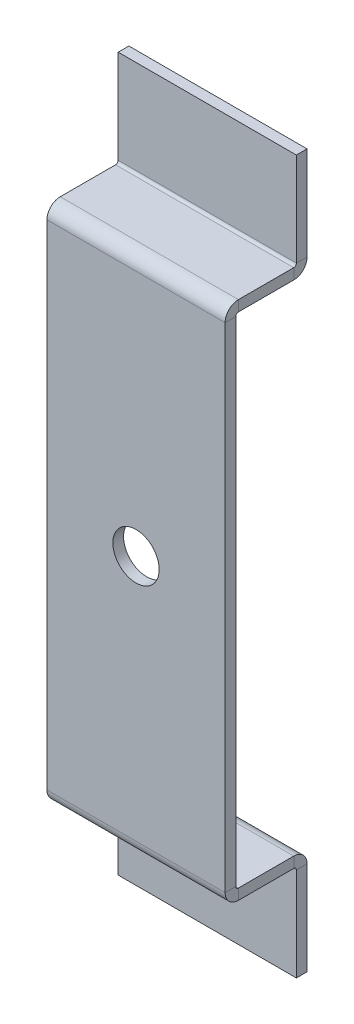
ISO-10303-21;
HEADER;
FILE_DESCRIPTION(('STEP AP214'),'2;1');
FILE_NAME('part.step','',(''),(''),'','','');
FILE_SCHEMA(('AUTOMOTIVE_DESIGN { 1 0 10303 214 1 1 1 1 }'));
ENDSEC;
DATA;
#1=APPLICATION_CONTEXT('core data for automotive mechanical design processes');
#2=APPLICATION_PROTOCOL_DEFINITION('international standard','automotive_design',2000,#1);
#3=PRODUCT_CONTEXT('',#1,'mechanical');
#4=PRODUCT('Part','Part','',(#3));
#5=PRODUCT_RELATED_PRODUCT_CATEGORY('part','',(#4));
#6=PRODUCT_DEFINITION_FORMATION('','',#4);
#7=PRODUCT_DEFINITION_CONTEXT('part definition',#1,'design');
#8=PRODUCT_DEFINITION('design','',#6,#7);
#9=PRODUCT_DEFINITION_SHAPE('','',#8);
#10=(LENGTH_UNIT() NAMED_UNIT(*) SI_UNIT(.MILLI.,.METRE.));
#11=(NAMED_UNIT(*) PLANE_ANGLE_UNIT() SI_UNIT($,.RADIAN.));
#12=(NAMED_UNIT(*) SI_UNIT($,.STERADIAN.) SOLID_ANGLE_UNIT());
#13=UNCERTAINTY_MEASURE_WITH_UNIT(LENGTH_MEASURE(1.E-05),#10,'distance_accuracy_value','');
#14=(GEOMETRIC_REPRESENTATION_CONTEXT(3) GLOBAL_UNCERTAINTY_ASSIGNED_CONTEXT((#13)) GLOBAL_UNIT_ASSIGNED_CONTEXT((#10,
#11,#12)) REPRESENTATION_CONTEXT('',''));
#15=CARTESIAN_POINT('',(0.,0.,0.));
#16=DIRECTION('',(0.,0.,1.));
#17=DIRECTION('',(1.,0.,0.));
#18=AXIS2_PLACEMENT_3D('',#15,#16,#17);
#19=CARTESIAN_POINT('',(0.,143.,-20.));
#20=DIRECTION('',(-1.,0.,0.));
#21=DIRECTION('',(0.,0.,1.));
#22=AXIS2_PLACEMENT_3D('',#19,#20,#21);
#23=PLANE('',#22);
#24=DIRECTION('',(0.,0.,-1.));
#25=VECTOR('',#24,1.);
#26=CARTESIAN_POINT('',(0.,143.,-20.));
#27=LINE('',#26,#25);
#28=CARTESIAN_POINT('',(0.,143.,-3.7366));
#29=VERTEX_POINT('',#28);
#30=CARTESIAN_POINT('',(0.,143.,-19.2634));
#31=VERTEX_POINT('',#30);
#32=EDGE_CURVE('E351',#29,#31,#27,.T.);
#33=ORIENTED_EDGE('',*,*,#32,.T.);
#34=DIRECTION('',(0.,-1.,0.));
#35=VECTOR('',#34,1.);
#36=CARTESIAN_POINT('',(0.,143.,-19.2634));
#37=LINE('',#36,#35);
#38=CARTESIAN_POINT('',(0.,140.,-19.2634));
#39=VERTEX_POINT('',#38);
#40=EDGE_CURVE('E233',#31,#39,#37,.T.);
#41=ORIENTED_EDGE('',*,*,#40,.T.);
#42=DIRECTION('',(0.,0.,-1.));
#43=VECTOR('',#42,1.);
#44=CARTESIAN_POINT('',(0.,140.,-20.));
#45=LINE('',#44,#43);
#46=CARTESIAN_POINT('',(0.,140.,-3.73660000000001));
#47=VERTEX_POINT('',#46);
#48=EDGE_CURVE('E350',#47,#39,#45,.T.);
#49=ORIENTED_EDGE('',*,*,#48,.F.);
#50=DIRECTION('',(0.,1.,0.));
#51=VECTOR('',#50,1.);
#52=CARTESIAN_POINT('',(0.,140.,-3.73660000000001));
#53=LINE('',#52,#51);
#54=EDGE_CURVE('E336',#47,#29,#53,.T.);
#55=ORIENTED_EDGE('',*,*,#54,.T.);
#56=EDGE_LOOP('',(#33,#41,#49,#55));
#57=FACE_BOUND('',#56,.T.);
#58=ADVANCED_FACE('F39',(#57),#23,.T.);
#59=CARTESIAN_POINT('',(0.,143.,4.67625101215123E-13));
#60=DIRECTION('',(0.,1.,0.));
#61=DIRECTION('',(0.,0.,1.));
#62=AXIS2_PLACEMENT_3D('',#59,#60,#61);
#63=PLANE('',#62);
#64=DIRECTION('',(0.,0.,1.));
#65=VECTOR('',#64,1.);
#66=CARTESIAN_POINT('',(50.,143.,-2.99999999999999));
#67=LINE('',#66,#65);
#68=CARTESIAN_POINT('',(50.,143.,-19.2634));
#69=VERTEX_POINT('',#68);
#70=CARTESIAN_POINT('',(50.,143.,-3.7366));
#71=VERTEX_POINT('',#70);
#72=EDGE_CURVE('E353',#69,#71,#67,.T.);
#73=ORIENTED_EDGE('',*,*,#72,.F.);
#74=DIRECTION('',(-1.,0.,0.));
#75=VECTOR('',#74,1.);
#76=CARTESIAN_POINT('',(0.,143.,-19.2634));
#77=LINE('',#76,#75);
#78=EDGE_CURVE('E63',#31,#69,#77,.F.);
#79=ORIENTED_EDGE('',*,*,#78,.F.);
#80=ORIENTED_EDGE('',*,*,#32,.F.);
#81=DIRECTION('',(1.,0.,0.));
#82=VECTOR('',#81,1.);
#83=CARTESIAN_POINT('',(0.,143.,-3.7366));
#84=LINE('',#83,#82);
#85=EDGE_CURVE('E345',#29,#71,#84,.T.);
#86=ORIENTED_EDGE('',*,*,#85,.T.);
#87=EDGE_LOOP('',(#73,#79,#80,#86));
#88=FACE_BOUND('',#87,.T.);
#89=ADVANCED_FACE('F400',(#88),#63,.T.);
#90=CARTESIAN_POINT('',(0.,140.,4.57150657198594E-13));
#91=DIRECTION('',(0.,1.,0.));
#92=DIRECTION('',(0.,0.,1.));
#93=AXIS2_PLACEMENT_3D('',#90,#91,#92);
#94=PLANE('',#93);
#95=DIRECTION('',(-1.,0.,0.));
#96=VECTOR('',#95,1.);
#97=CARTESIAN_POINT('',(0.,140.,-19.2634));
#98=LINE('',#97,#96);
#99=CARTESIAN_POINT('',(50.,140.,-19.2634));
#100=VERTEX_POINT('',#99);
#101=EDGE_CURVE('E186',#39,#100,#98,.F.);
#102=ORIENTED_EDGE('',*,*,#101,.T.);
#103=DIRECTION('',(0.,0.,1.));
#104=VECTOR('',#103,1.);
#105=CARTESIAN_POINT('',(50.,140.,-3.));
#106=LINE('',#105,#104);
#107=CARTESIAN_POINT('',(50.,140.,-3.73660000000001));
#108=VERTEX_POINT('',#107);
#109=EDGE_CURVE('E354',#100,#108,#106,.T.);
#110=ORIENTED_EDGE('',*,*,#109,.T.);
#111=DIRECTION('',(1.,0.,0.));
#112=VECTOR('',#111,1.);
#113=CARTESIAN_POINT('',(0.,140.,-3.73660000000001));
#114=LINE('',#113,#112);
#115=EDGE_CURVE('E339',#47,#108,#114,.T.);
#116=ORIENTED_EDGE('',*,*,#115,.F.);
#117=ORIENTED_EDGE('',*,*,#48,.T.);
#118=EDGE_LOOP('',(#102,#110,#116,#117));
#119=FACE_BOUND('',#118,.T.);
#120=ADVANCED_FACE('F408',(#119),#94,.F.);
#121=CARTESIAN_POINT('',(50.,-3.,-2.99999999999999));
#122=DIRECTION('',(1.,0.,0.));
#123=DIRECTION('',(0.,0.,-1.));
#124=AXIS2_PLACEMENT_3D('',#121,#122,#123);
#125=PLANE('',#124);
#126=DIRECTION('',(0.,0.,-1.));
#127=VECTOR('',#126,1.);
#128=CARTESIAN_POINT('',(50.,-3.,-2.99999999999999));
#129=LINE('',#128,#127);
#130=CARTESIAN_POINT('',(50.,-3.,-3.73659999999999));
#131=VERTEX_POINT('',#130);
#132=CARTESIAN_POINT('',(50.,-3.00000000000006,-19.2634));
#133=VERTEX_POINT('',#132);
#134=EDGE_CURVE('E306',#131,#133,#129,.T.);
#135=ORIENTED_EDGE('',*,*,#134,.T.);
#136=DIRECTION('',(0.,1.,0.));
#137=VECTOR('',#136,1.);
#138=CARTESIAN_POINT('',(50.,-3.00000000000006,-19.2634));
#139=LINE('',#138,#137);
#140=CARTESIAN_POINT('',(50.,0.,-19.2634));
#141=VERTEX_POINT('',#140);
#142=EDGE_CURVE('E279',#133,#141,#139,.T.);
#143=ORIENTED_EDGE('',*,*,#142,.T.);
#144=DIRECTION('',(0.,0.,-1.));
#145=VECTOR('',#144,1.);
#146=CARTESIAN_POINT('',(50.,0.,-3.));
#147=LINE('',#146,#145);
#148=CARTESIAN_POINT('',(50.,0.,-3.7366));
#149=VERTEX_POINT('',#148);
#150=EDGE_CURVE('E305',#149,#141,#147,.T.);
#151=ORIENTED_EDGE('',*,*,#150,.F.);
#152=DIRECTION('',(0.,-1.,0.));
#153=VECTOR('',#152,1.);
#154=CARTESIAN_POINT('',(50.,0.,-3.7366));
#155=LINE('',#154,#153);
#156=EDGE_CURVE('E292',#149,#131,#155,.T.);
#157=ORIENTED_EDGE('',*,*,#156,.T.);
#158=EDGE_LOOP('',(#135,#143,#151,#157));
#159=FACE_BOUND('',#158,.T.);
#160=ADVANCED_FACE('F432',(#159),#125,.T.);
#161=CARTESIAN_POINT('',(0.,-2.99999999999999,0.));
#162=DIRECTION('',(0.,1.,0.));
#163=DIRECTION('',(0.,0.,1.));
#164=AXIS2_PLACEMENT_3D('',#161,#162,#163);
#165=PLANE('',#164);
#166=DIRECTION('',(1.,0.,0.));
#167=VECTOR('',#166,1.);
#168=CARTESIAN_POINT('',(50.,-3.00000000000006,-19.2634));
#169=LINE('',#168,#167);
#170=CARTESIAN_POINT('',(0.,-3.00000000000006,-19.2634));
#171=VERTEX_POINT('',#170);
#172=EDGE_CURVE('E285',#133,#171,#169,.F.);
#173=ORIENTED_EDGE('',*,*,#172,.F.);
#174=ORIENTED_EDGE('',*,*,#134,.F.);
#175=DIRECTION('',(1.,0.,0.));
#176=VECTOR('',#175,1.);
#177=CARTESIAN_POINT('',(0.,-3.,-3.73659999999999));
#178=LINE('',#177,#176);
#179=CARTESIAN_POINT('',(0.,-3.,-3.73659999999999));
#180=VERTEX_POINT('',#179);
#181=EDGE_CURVE('E301',#180,#131,#178,.T.);
#182=ORIENTED_EDGE('',*,*,#181,.F.);
#183=DIRECTION('',(0.,0.,1.));
#184=VECTOR('',#183,1.);
#185=CARTESIAN_POINT('',(0.,-3.00000000000006,-20.));
#186=LINE('',#185,#184);
#187=EDGE_CURVE('E309',#171,#180,#186,.T.);
#188=ORIENTED_EDGE('',*,*,#187,.F.);
#189=EDGE_LOOP('',(#173,#174,#182,#188));
#190=FACE_BOUND('',#189,.T.);
#191=ADVANCED_FACE('F445',(#190),#165,.F.);
#192=CARTESIAN_POINT('',(0.,0.,0.));
#193=DIRECTION('',(0.,1.,0.));
#194=DIRECTION('',(0.,0.,1.));
#195=AXIS2_PLACEMENT_3D('',#192,#193,#194);
#196=PLANE('',#195);
#197=ORIENTED_EDGE('',*,*,#150,.T.);
#198=DIRECTION('',(1.,0.,0.));
#199=VECTOR('',#198,1.);
#200=CARTESIAN_POINT('',(50.,0.,-19.2634));
#201=LINE('',#200,#199);
#202=CARTESIAN_POINT('',(0.,0.,-19.2634));
#203=VERTEX_POINT('',#202);
#204=EDGE_CURVE('E272',#141,#203,#201,.F.);
#205=ORIENTED_EDGE('',*,*,#204,.T.);
#206=DIRECTION('',(0.,0.,1.));
#207=VECTOR('',#206,1.);
#208=CARTESIAN_POINT('',(0.,0.,-20.));
#209=LINE('',#208,#207);
#210=CARTESIAN_POINT('',(0.,0.,-3.7366));
#211=VERTEX_POINT('',#210);
#212=EDGE_CURVE('E310',#203,#211,#209,.T.);
#213=ORIENTED_EDGE('',*,*,#212,.T.);
#214=DIRECTION('',(-1.,0.,0.));
#215=VECTOR('',#214,1.);
#216=CARTESIAN_POINT('',(50.,0.,-3.7366));
#217=LINE('',#216,#215);
#218=EDGE_CURVE('E295',#149,#211,#217,.T.);
#219=ORIENTED_EDGE('',*,*,#218,.F.);
#220=EDGE_LOOP('',(#197,#205,#213,#219));
#221=FACE_BOUND('',#220,.T.);
#222=ADVANCED_FACE('F429',(#221),#196,.T.);
#223=CARTESIAN_POINT('',(0.,0.,-3.));
#224=DIRECTION('',(0.,0.,-1.));
#225=DIRECTION('',(-1.,0.,0.));
#226=AXIS2_PLACEMENT_3D('',#223,#224,#225);
#227=PLANE('',#226);
#228=CARTESIAN_POINT('',(25.,69.9999999999999,-3.));
#229=DIRECTION('',(0.,0.,-1.));
#230=DIRECTION('',(-1.,0.,0.));
#231=AXIS2_PLACEMENT_3D('',#228,#229,#230);
#232=CIRCLE('',#231,6.50000000000001);
#233=CARTESIAN_POINT('',(18.5,69.9999999999999,-3.));
#234=VERTEX_POINT('',#233);
#235=EDGE_CURVE('E489',#234,#234,#232,.T.);
#236=ORIENTED_EDGE('',*,*,#235,.F.);
#237=EDGE_LOOP('',(#236));
#238=FACE_BOUND('',#237,.T.);
#239=DIRECTION('',(0.,1.,0.));
#240=VECTOR('',#239,1.);
#241=CARTESIAN_POINT('',(50.,0.,-3.));
#242=LINE('',#241,#240);
#243=CARTESIAN_POINT('',(50.,0.736600000000001,-3.));
#244=VERTEX_POINT('',#243);
#245=CARTESIAN_POINT('',(50.,139.2634,-3.));
#246=VERTEX_POINT('',#245);
#247=EDGE_CURVE('E11',#244,#246,#242,.T.);
#248=ORIENTED_EDGE('',*,*,#247,.F.);
#249=DIRECTION('',(-1.,0.,0.));
#250=VECTOR('',#249,1.);
#251=CARTESIAN_POINT('',(0.,0.736599999999997,-3.));
#252=LINE('',#251,#250);
#253=CARTESIAN_POINT('',(0.,0.736599999999997,-3.));
#254=VERTEX_POINT('',#253);
#255=EDGE_CURVE('E328',#254,#244,#252,.F.);
#256=ORIENTED_EDGE('',*,*,#255,.F.);
#257=DIRECTION('',(0.,-1.,0.));
#258=VECTOR('',#257,1.);
#259=CARTESIAN_POINT('',(0.,0.,-3.));
#260=LINE('',#259,#258);
#261=CARTESIAN_POINT('',(0.,139.2634,-3.));
#262=VERTEX_POINT('',#261);
#263=EDGE_CURVE('E48',#262,#254,#260,.T.);
#264=ORIENTED_EDGE('',*,*,#263,.F.);
#265=DIRECTION('',(1.,0.,0.));
#266=VECTOR('',#265,1.);
#267=CARTESIAN_POINT('',(50.,139.2634,-3.));
#268=LINE('',#267,#266);
#269=EDGE_CURVE('E372',#246,#262,#268,.F.);
#270=ORIENTED_EDGE('',*,*,#269,.F.);
#271=EDGE_LOOP('',(#248,#256,#264,#270));
#272=FACE_BOUND('',#271,.T.);
#273=ADVANCED_FACE('F415',(#238,#272),#227,.T.);
#274=CARTESIAN_POINT('',(0.,0.,0.));
#275=DIRECTION('',(0.,0.,-1.));
#276=DIRECTION('',(-1.,0.,0.));
#277=AXIS2_PLACEMENT_3D('',#274,#275,#276);
#278=PLANE('',#277);
#279=CARTESIAN_POINT('',(25.,69.9999999999999,0.));
#280=DIRECTION('',(0.,0.,1.));
#281=DIRECTION('',(1.,0.,0.));
#282=AXIS2_PLACEMENT_3D('',#279,#280,#281);
#283=CIRCLE('',#282,6.50000000000001);
#284=CARTESIAN_POINT('',(31.5,69.9999999999999,0.));
#285=VERTEX_POINT('',#284);
#286=EDGE_CURVE('E487',#285,#285,#283,.T.);
#287=ORIENTED_EDGE('',*,*,#286,.F.);
#288=EDGE_LOOP('',(#287));
#289=FACE_BOUND('',#288,.T.);
#290=DIRECTION('',(-1.,0.,0.));
#291=VECTOR('',#290,1.);
#292=CARTESIAN_POINT('',(0.,0.736600000000005,0.));
#293=LINE('',#292,#291);
#294=CARTESIAN_POINT('',(0.,0.736600000000005,0.));
#295=VERTEX_POINT('',#294);
#296=CARTESIAN_POINT('',(50.,0.736600000000001,0.));
#297=VERTEX_POINT('',#296);
#298=EDGE_CURVE('E316',#295,#297,#293,.F.);
#299=ORIENTED_EDGE('',*,*,#298,.T.);
#300=DIRECTION('',(0.,1.,0.));
#301=VECTOR('',#300,1.);
#302=CARTESIAN_POINT('',(50.,0.,0.));
#303=LINE('',#302,#301);
#304=CARTESIAN_POINT('',(50.,139.2634,0.));
#305=VERTEX_POINT('',#304);
#306=EDGE_CURVE('E43',#297,#305,#303,.T.);
#307=ORIENTED_EDGE('',*,*,#306,.T.);
#308=DIRECTION('',(1.,0.,0.));
#309=VECTOR('',#308,1.);
#310=CARTESIAN_POINT('',(50.,139.2634,0.));
#311=LINE('',#310,#309);
#312=CARTESIAN_POINT('',(0.,139.2634,0.));
#313=VERTEX_POINT('',#312);
#314=EDGE_CURVE('E360',#305,#313,#311,.F.);
#315=ORIENTED_EDGE('',*,*,#314,.T.);
#316=DIRECTION('',(0.,-1.,0.));
#317=VECTOR('',#316,1.);
#318=CARTESIAN_POINT('',(0.,0.,0.));
#319=LINE('',#318,#317);
#320=EDGE_CURVE('E380',#313,#295,#319,.T.);
#321=ORIENTED_EDGE('',*,*,#320,.T.);
#322=EDGE_LOOP('',(#299,#307,#315,#321));
#323=FACE_BOUND('',#322,.T.);
#324=ADVANCED_FACE('F388',(#289,#323),#278,.F.);
#325=CARTESIAN_POINT('',(0.,0.,-3.));
#326=DIRECTION('',(-1.,0.,0.));
#327=DIRECTION('',(0.,-1.,0.));
#328=AXIS2_PLACEMENT_3D('',#325,#326,#327);
#329=PLANE('',#328);
#330=ORIENTED_EDGE('',*,*,#263,.T.);
#331=DIRECTION('',(0.,0.,1.));
#332=VECTOR('',#331,1.);
#333=CARTESIAN_POINT('',(0.,0.736599999999997,-3.));
#334=LINE('',#333,#332);
#335=EDGE_CURVE('E322',#254,#295,#334,.T.);
#336=ORIENTED_EDGE('',*,*,#335,.T.);
#337=ORIENTED_EDGE('',*,*,#320,.F.);
#338=DIRECTION('',(0.,0.,1.));
#339=VECTOR('',#338,1.);
#340=CARTESIAN_POINT('',(0.,139.2634,-3.));
#341=LINE('',#340,#339);
#342=EDGE_CURVE('E377',#262,#313,#341,.T.);
#343=ORIENTED_EDGE('',*,*,#342,.F.);
#344=EDGE_LOOP('',(#330,#336,#337,#343));
#345=FACE_BOUND('',#344,.T.);
#346=ADVANCED_FACE('F41',(#345),#329,.T.);
#347=CARTESIAN_POINT('',(50.,0.,-3.));
#348=DIRECTION('',(1.,0.,0.));
#349=DIRECTION('',(0.,1.,0.));
#350=AXIS2_PLACEMENT_3D('',#347,#348,#349);
#351=PLANE('',#350);
#352=DIRECTION('',(0.,0.,1.));
#353=VECTOR('',#352,1.);
#354=CARTESIAN_POINT('',(50.,0.736600000000001,-3.));
#355=LINE('',#354,#353);
#356=EDGE_CURVE('E333',#244,#297,#355,.T.);
#357=ORIENTED_EDGE('',*,*,#356,.F.);
#358=ORIENTED_EDGE('',*,*,#247,.T.);
#359=DIRECTION('',(0.,0.,1.));
#360=VECTOR('',#359,1.);
#361=CARTESIAN_POINT('',(50.,139.2634,-3.));
#362=LINE('',#361,#360);
#363=EDGE_CURVE('E366',#246,#305,#362,.T.);
#364=ORIENTED_EDGE('',*,*,#363,.T.);
#365=ORIENTED_EDGE('',*,*,#306,.F.);
#366=EDGE_LOOP('',(#357,#358,#364,#365));
#367=FACE_BOUND('',#366,.T.);
#368=ADVANCED_FACE('F455',(#367),#351,.T.);
#369=CARTESIAN_POINT('',(0.,139.2634,-3.73660000000001));
#370=DIRECTION('',(-1.,0.,0.));
#371=DIRECTION('',(0.,0.,1.));
#372=AXIS2_PLACEMENT_3D('',#369,#370,#371);
#373=PLANE('',#372);
#374=ORIENTED_EDGE('',*,*,#54,.F.);
#375=CARTESIAN_POINT('',(0.,139.2634,-3.73660000000001));
#376=DIRECTION('',(1.,0.,0.));
#377=DIRECTION('',(0.,0.,-1.));
#378=AXIS2_PLACEMENT_3D('',#375,#376,#377);
#379=CIRCLE('',#378,0.736600000000004);
#380=EDGE_CURVE('E369',#262,#47,#379,.F.);
#381=ORIENTED_EDGE('',*,*,#380,.F.);
#382=ORIENTED_EDGE('',*,*,#342,.T.);
#383=CARTESIAN_POINT('',(0.,139.2634,-3.73660000000001));
#384=DIRECTION('',(1.,0.,0.));
#385=DIRECTION('',(0.,0.,-1.));
#386=AXIS2_PLACEMENT_3D('',#383,#384,#385);
#387=CIRCLE('',#386,3.7366);
#388=EDGE_CURVE('E362',#313,#29,#387,.F.);
#389=ORIENTED_EDGE('',*,*,#388,.T.);
#390=EDGE_LOOP('',(#374,#381,#382,#389));
#391=FACE_BOUND('',#390,.T.);
#392=ADVANCED_FACE('F402',(#391),#373,.T.);
#393=CARTESIAN_POINT('',(50.,139.2634,-3.73660000000001));
#394=DIRECTION('',(-1.,0.,0.));
#395=DIRECTION('',(0.,0.,1.));
#396=AXIS2_PLACEMENT_3D('',#393,#394,#395);
#397=PLANE('',#396);
#398=CARTESIAN_POINT('',(50.,139.2634,-3.73660000000001));
#399=DIRECTION('',(1.,0.,0.));
#400=DIRECTION('',(0.,0.,-1.));
#401=AXIS2_PLACEMENT_3D('',#398,#399,#400);
#402=CIRCLE('',#401,0.736600000000004);
#403=EDGE_CURVE('E356',#108,#246,#402,.T.);
#404=ORIENTED_EDGE('',*,*,#403,.F.);
#405=DIRECTION('',(0.,1.,0.));
#406=VECTOR('',#405,1.);
#407=CARTESIAN_POINT('',(50.,140.,-3.73660000000001));
#408=LINE('',#407,#406);
#409=EDGE_CURVE('E342',#108,#71,#408,.T.);
#410=ORIENTED_EDGE('',*,*,#409,.T.);
#411=CARTESIAN_POINT('',(50.,139.2634,-3.73660000000001));
#412=DIRECTION('',(1.,0.,0.));
#413=DIRECTION('',(0.,0.,-1.));
#414=AXIS2_PLACEMENT_3D('',#411,#412,#413);
#415=CIRCLE('',#414,3.7366);
#416=EDGE_CURVE('E363',#71,#305,#415,.T.);
#417=ORIENTED_EDGE('',*,*,#416,.T.);
#418=ORIENTED_EDGE('',*,*,#363,.F.);
#419=EDGE_LOOP('',(#404,#410,#417,#418));
#420=FACE_BOUND('',#419,.T.);
#421=ADVANCED_FACE('F398',(#420),#397,.F.);
#422=CARTESIAN_POINT('',(50.,139.2634,-3.73660000000001));
#423=DIRECTION('',(1.,0.,0.));
#424=DIRECTION('',(0.,1.,0.));
#425=AXIS2_PLACEMENT_3D('',#422,#423,#424);
#426=CYLINDRICAL_SURFACE('',#425,3.7366);
#427=ORIENTED_EDGE('',*,*,#314,.F.);
#428=ORIENTED_EDGE('',*,*,#416,.F.);
#429=ORIENTED_EDGE('',*,*,#85,.F.);
#430=ORIENTED_EDGE('',*,*,#388,.F.);
#431=EDGE_LOOP('',(#427,#428,#429,#430));
#432=FACE_BOUND('',#431,.T.);
#433=ADVANCED_FACE('F394',(#432),#426,.T.);
#434=CARTESIAN_POINT('',(50.,139.2634,-3.73660000000001));
#435=DIRECTION('',(1.,0.,0.));
#436=DIRECTION('',(0.,1.,0.));
#437=AXIS2_PLACEMENT_3D('',#434,#435,#436);
#438=CYLINDRICAL_SURFACE('',#437,0.736600000000004);
#439=ORIENTED_EDGE('',*,*,#269,.T.);
#440=ORIENTED_EDGE('',*,*,#380,.T.);
#441=ORIENTED_EDGE('',*,*,#115,.T.);
#442=ORIENTED_EDGE('',*,*,#403,.T.);
#443=EDGE_LOOP('',(#439,#440,#441,#442));
#444=FACE_BOUND('',#443,.T.);
#445=ADVANCED_FACE('F410',(#444),#438,.F.);
#446=CARTESIAN_POINT('',(50.,143.,-2.99999999999999));
#447=DIRECTION('',(1.,0.,0.));
#448=DIRECTION('',(0.,0.,-1.));
#449=AXIS2_PLACEMENT_3D('',#446,#447,#448);
#450=PLANE('',#449);
#451=DIRECTION('',(0.,-1.,0.));
#452=VECTOR('',#451,1.);
#453=CARTESIAN_POINT('',(50.,143.,-19.2634));
#454=LINE('',#453,#452);
#455=EDGE_CURVE('E56',#69,#100,#454,.T.);
#456=ORIENTED_EDGE('',*,*,#455,.F.);
#457=ORIENTED_EDGE('',*,*,#72,.T.);
#458=ORIENTED_EDGE('',*,*,#409,.F.);
#459=ORIENTED_EDGE('',*,*,#109,.F.);
#460=EDGE_LOOP('',(#456,#457,#458,#459));
#461=FACE_BOUND('',#460,.T.);
#462=ADVANCED_FACE('F471',(#461),#450,.T.);
#463=CARTESIAN_POINT('',(50.,0.736599999999999,-3.7366));
#464=DIRECTION('',(1.,0.,0.));
#465=DIRECTION('',(0.,1.,0.));
#466=AXIS2_PLACEMENT_3D('',#463,#464,#465);
#467=PLANE('',#466);
#468=ORIENTED_EDGE('',*,*,#156,.F.);
#469=CARTESIAN_POINT('',(50.,0.736599999999999,-3.7366));
#470=DIRECTION('',(-1.,0.,0.));
#471=DIRECTION('',(0.,-1.,0.));
#472=AXIS2_PLACEMENT_3D('',#469,#470,#471);
#473=CIRCLE('',#472,0.736600000000002);
#474=EDGE_CURVE('E325',#244,#149,#473,.F.);
#475=ORIENTED_EDGE('',*,*,#474,.F.);
#476=ORIENTED_EDGE('',*,*,#356,.T.);
#477=CARTESIAN_POINT('',(50.,0.736599999999999,-3.7366));
#478=DIRECTION('',(-1.,0.,0.));
#479=DIRECTION('',(0.,-1.,0.));
#480=AXIS2_PLACEMENT_3D('',#477,#478,#479);
#481=CIRCLE('',#480,3.7366);
#482=EDGE_CURVE('E318',#297,#131,#481,.F.);
#483=ORIENTED_EDGE('',*,*,#482,.T.);
#484=EDGE_LOOP('',(#468,#475,#476,#483));
#485=FACE_BOUND('',#484,.T.);
#486=ADVANCED_FACE('F454',(#485),#467,.T.);
#487=CARTESIAN_POINT('',(0.,0.736599999999996,-3.7366));
#488=DIRECTION('',(1.,0.,0.));
#489=DIRECTION('',(0.,1.,0.));
#490=AXIS2_PLACEMENT_3D('',#487,#488,#489);
#491=PLANE('',#490);
#492=CARTESIAN_POINT('',(0.,0.736599999999996,-3.7366));
#493=DIRECTION('',(-1.,0.,0.));
#494=DIRECTION('',(0.,-1.,0.));
#495=AXIS2_PLACEMENT_3D('',#492,#493,#494);
#496=CIRCLE('',#495,0.736600000000002);
#497=EDGE_CURVE('E312',#211,#254,#496,.T.);
#498=ORIENTED_EDGE('',*,*,#497,.F.);
#499=DIRECTION('',(0.,-1.,0.));
#500=VECTOR('',#499,1.);
#501=CARTESIAN_POINT('',(0.,0.,-3.7366));
#502=LINE('',#501,#500);
#503=EDGE_CURVE('E298',#211,#180,#502,.T.);
#504=ORIENTED_EDGE('',*,*,#503,.T.);
#505=CARTESIAN_POINT('',(0.,0.736599999999996,-3.7366));
#506=DIRECTION('',(-1.,0.,0.));
#507=DIRECTION('',(0.,-1.,0.));
#508=AXIS2_PLACEMENT_3D('',#505,#506,#507);
#509=CIRCLE('',#508,3.7366);
#510=EDGE_CURVE('E319',#180,#295,#509,.T.);
#511=ORIENTED_EDGE('',*,*,#510,.T.);
#512=ORIENTED_EDGE('',*,*,#335,.F.);
#513=EDGE_LOOP('',(#498,#504,#511,#512));
#514=FACE_BOUND('',#513,.T.);
#515=ADVANCED_FACE('F420',(#514),#491,.F.);
#516=CARTESIAN_POINT('',(0.,0.736599999999996,-3.7366));
#517=DIRECTION('',(-1.,0.,0.));
#518=DIRECTION('',(0.,-1.,0.));
#519=AXIS2_PLACEMENT_3D('',#516,#517,#518);
#520=CYLINDRICAL_SURFACE('',#519,3.7366);
#521=ORIENTED_EDGE('',*,*,#298,.F.);
#522=ORIENTED_EDGE('',*,*,#510,.F.);
#523=ORIENTED_EDGE('',*,*,#181,.T.);
#524=ORIENTED_EDGE('',*,*,#482,.F.);
#525=EDGE_LOOP('',(#521,#522,#523,#524));
#526=FACE_BOUND('',#525,.T.);
#527=ADVANCED_FACE('F451',(#526),#520,.T.);
#528=CARTESIAN_POINT('',(0.,0.736599999999996,-3.7366));
#529=DIRECTION('',(-1.,0.,0.));
#530=DIRECTION('',(0.,-1.,0.));
#531=AXIS2_PLACEMENT_3D('',#528,#529,#530);
#532=CYLINDRICAL_SURFACE('',#531,0.736600000000002);
#533=ORIENTED_EDGE('',*,*,#255,.T.);
#534=ORIENTED_EDGE('',*,*,#474,.T.);
#535=ORIENTED_EDGE('',*,*,#218,.T.);
#536=ORIENTED_EDGE('',*,*,#497,.T.);
#537=EDGE_LOOP('',(#533,#534,#535,#536));
#538=FACE_BOUND('',#537,.T.);
#539=ADVANCED_FACE('F424',(#538),#532,.F.);
#540=CARTESIAN_POINT('',(0.,-3.00000000000006,-20.));
#541=DIRECTION('',(-1.,0.,0.));
#542=DIRECTION('',(0.,0.,1.));
#543=AXIS2_PLACEMENT_3D('',#540,#541,#542);
#544=PLANE('',#543);
#545=DIRECTION('',(0.,1.,0.));
#546=VECTOR('',#545,1.);
#547=CARTESIAN_POINT('',(0.,-3.00000000000006,-19.2634));
#548=LINE('',#547,#546);
#549=EDGE_CURVE('E289',#171,#203,#548,.T.);
#550=ORIENTED_EDGE('',*,*,#549,.F.);
#551=ORIENTED_EDGE('',*,*,#187,.T.);
#552=ORIENTED_EDGE('',*,*,#503,.F.);
#553=ORIENTED_EDGE('',*,*,#212,.F.);
#554=EDGE_LOOP('',(#550,#551,#552,#553));
#555=FACE_BOUND('',#554,.T.);
#556=ADVANCED_FACE('F449',(#555),#544,.T.);
#557=CARTESIAN_POINT('',(0.,-3.73660000000006,-19.2634));
#558=DIRECTION('',(-1.,0.,0.));
#559=DIRECTION('',(0.,0.,1.));
#560=AXIS2_PLACEMENT_3D('',#557,#558,#559);
#561=PLANE('',#560);
#562=DIRECTION('',(0.,0.,-1.));
#563=VECTOR('',#562,1.);
#564=CARTESIAN_POINT('',(0.,-3.73660000000006,-20.));
#565=LINE('',#564,#563);
#566=CARTESIAN_POINT('',(0.,-3.73660000000006,-20.));
#567=VERTEX_POINT('',#566);
#568=CARTESIAN_POINT('',(0.,-3.73660000000006,-23.));
#569=VERTEX_POINT('',#568);
#570=EDGE_CURVE('E240',#567,#569,#565,.T.);
#571=ORIENTED_EDGE('',*,*,#570,.F.);
#572=CARTESIAN_POINT('',(0.,-3.73660000000006,-19.2634));
#573=DIRECTION('',(1.,0.,0.));
#574=DIRECTION('',(0.,0.,-1.));
#575=AXIS2_PLACEMENT_3D('',#572,#573,#574);
#576=CIRCLE('',#575,0.7366);
#577=EDGE_CURVE('E282',#171,#567,#576,.F.);
#578=ORIENTED_EDGE('',*,*,#577,.F.);
#579=ORIENTED_EDGE('',*,*,#549,.T.);
#580=CARTESIAN_POINT('',(0.,-3.73660000000006,-19.2634));
#581=DIRECTION('',(1.,0.,0.));
#582=DIRECTION('',(0.,0.,-1.));
#583=AXIS2_PLACEMENT_3D('',#580,#581,#582);
#584=CIRCLE('',#583,3.7366);
#585=EDGE_CURVE('E275',#203,#569,#584,.F.);
#586=ORIENTED_EDGE('',*,*,#585,.T.);
#587=EDGE_LOOP('',(#571,#578,#579,#586));
#588=FACE_BOUND('',#587,.T.);
#589=ADVANCED_FACE('F559',(#588),#561,.T.);
#590=CARTESIAN_POINT('',(50.,-3.73660000000006,-19.2634));
#591=DIRECTION('',(-1.,0.,0.));
#592=DIRECTION('',(0.,0.,1.));
#593=AXIS2_PLACEMENT_3D('',#590,#591,#592);
#594=PLANE('',#593);
#595=CARTESIAN_POINT('',(50.,-3.73660000000006,-19.2634));
#596=DIRECTION('',(1.,0.,0.));
#597=DIRECTION('',(0.,0.,-1.));
#598=AXIS2_PLACEMENT_3D('',#595,#596,#597);
#599=CIRCLE('',#598,0.7366);
#600=CARTESIAN_POINT('',(50.,-3.73660000000006,-20.));
#601=VERTEX_POINT('',#600);
#602=EDGE_CURVE('E271',#601,#133,#599,.T.);
#603=ORIENTED_EDGE('',*,*,#602,.F.);
#604=DIRECTION('',(0.,0.,-1.));
#605=VECTOR('',#604,1.);
#606=CARTESIAN_POINT('',(50.,-3.73660000000006,-20.));
#607=LINE('',#606,#605);
#608=CARTESIAN_POINT('',(50.,-3.73660000000003,-23.));
#609=VERTEX_POINT('',#608);
#610=EDGE_CURVE('E244',#601,#609,#607,.T.);
#611=ORIENTED_EDGE('',*,*,#610,.T.);
#612=CARTESIAN_POINT('',(50.,-3.73660000000006,-19.2634));
#613=DIRECTION('',(1.,0.,0.));
#614=DIRECTION('',(0.,0.,-1.));
#615=AXIS2_PLACEMENT_3D('',#612,#613,#614);
#616=CIRCLE('',#615,3.7366);
#617=EDGE_CURVE('E276',#609,#141,#616,.T.);
#618=ORIENTED_EDGE('',*,*,#617,.T.);
#619=ORIENTED_EDGE('',*,*,#142,.F.);
#620=EDGE_LOOP('',(#603,#611,#618,#619));
#621=FACE_BOUND('',#620,.T.);
#622=ADVANCED_FACE('F436',(#621),#594,.F.);
#623=CARTESIAN_POINT('',(50.,-3.73660000000006,-19.2634));
#624=DIRECTION('',(1.,0.,0.));
#625=DIRECTION('',(0.,0.,-1.));
#626=AXIS2_PLACEMENT_3D('',#623,#624,#625);
#627=CYLINDRICAL_SURFACE('',#626,3.7366);
#628=ORIENTED_EDGE('',*,*,#204,.F.);
#629=ORIENTED_EDGE('',*,*,#617,.F.);
#630=DIRECTION('',(-1.,0.,0.));
#631=VECTOR('',#630,1.);
#632=CARTESIAN_POINT('',(0.,-3.73660000000003,-23.));
#633=LINE('',#632,#631);
#634=EDGE_CURVE('E247',#609,#569,#633,.T.);
#635=ORIENTED_EDGE('',*,*,#634,.T.);
#636=ORIENTED_EDGE('',*,*,#585,.F.);
#637=EDGE_LOOP('',(#628,#629,#635,#636));
#638=FACE_BOUND('',#637,.T.);
#639=ADVANCED_FACE('F553',(#638),#627,.T.);
#640=CARTESIAN_POINT('',(50.,-3.73660000000006,-19.2634));
#641=DIRECTION('',(1.,0.,0.));
#642=DIRECTION('',(0.,0.,-1.));
#643=AXIS2_PLACEMENT_3D('',#640,#641,#642);
#644=CYLINDRICAL_SURFACE('',#643,0.7366);
#645=ORIENTED_EDGE('',*,*,#172,.T.);
#646=ORIENTED_EDGE('',*,*,#577,.T.);
#647=DIRECTION('',(1.,0.,0.));
#648=VECTOR('',#647,1.);
#649=CARTESIAN_POINT('',(0.,-3.73660000000006,-20.));
#650=LINE('',#649,#648);
#651=EDGE_CURVE('E242',#567,#601,#650,.T.);
#652=ORIENTED_EDGE('',*,*,#651,.T.);
#653=ORIENTED_EDGE('',*,*,#602,.T.);
#654=EDGE_LOOP('',(#645,#646,#652,#653));
#655=FACE_BOUND('',#654,.T.);
#656=ADVANCED_FACE('F440',(#655),#644,.F.);
#657=CARTESIAN_POINT('',(50.,-30.0000000000001,-23.));
#658=DIRECTION('',(-1.,0.,0.));
#659=DIRECTION('',(0.,0.,1.));
#660=AXIS2_PLACEMENT_3D('',#657,#658,#659);
#661=PLANE('',#660);
#662=ORIENTED_EDGE('',*,*,#610,.F.);
#663=DIRECTION('',(0.,-1.,0.));
#664=VECTOR('',#663,1.);
#665=CARTESIAN_POINT('',(50.,-30.0000000000001,-20.));
#666=LINE('',#665,#664);
#667=CARTESIAN_POINT('',(50.,-30.0000000000001,-20.));
#668=VERTEX_POINT('',#667);
#669=EDGE_CURVE('E251',#601,#668,#666,.T.);
#670=ORIENTED_EDGE('',*,*,#669,.T.);
#671=DIRECTION('',(0.,0.,1.));
#672=VECTOR('',#671,1.);
#673=CARTESIAN_POINT('',(50.,-30.0000000000001,-23.));
#674=LINE('',#673,#672);
#675=CARTESIAN_POINT('',(50.,-30.0000000000001,-23.));
#676=VERTEX_POINT('',#675);
#677=EDGE_CURVE('E268',#676,#668,#674,.T.);
#678=ORIENTED_EDGE('',*,*,#677,.F.);
#679=DIRECTION('',(0.,-1.,0.));
#680=VECTOR('',#679,1.);
#681=CARTESIAN_POINT('',(50.,-30.0000000000001,-23.));
#682=LINE('',#681,#680);
#683=EDGE_CURVE('E252',#609,#676,#682,.T.);
#684=ORIENTED_EDGE('',*,*,#683,.F.);
#685=EDGE_LOOP('',(#662,#670,#678,#684));
#686=FACE_BOUND('',#685,.T.);
#687=ADVANCED_FACE('F545',(#686),#661,.F.);
#688=CARTESIAN_POINT('',(0.,-3.00000000000006,-23.));
#689=DIRECTION('',(1.,0.,0.));
#690=DIRECTION('',(0.,0.,-1.));
#691=AXIS2_PLACEMENT_3D('',#688,#689,#690);
#692=PLANE('',#691);
#693=ORIENTED_EDGE('',*,*,#570,.T.);
#694=DIRECTION('',(0.,1.,0.));
#695=VECTOR('',#694,1.);
#696=CARTESIAN_POINT('',(0.,-3.00000000000006,-23.));
#697=LINE('',#696,#695);
#698=CARTESIAN_POINT('',(0.,-30.0000000000001,-23.));
#699=VERTEX_POINT('',#698);
#700=EDGE_CURVE('E257',#699,#569,#697,.T.);
#701=ORIENTED_EDGE('',*,*,#700,.F.);
#702=DIRECTION('',(0.,0.,1.));
#703=VECTOR('',#702,1.);
#704=CARTESIAN_POINT('',(0.,-30.0000000000001,-23.));
#705=LINE('',#704,#703);
#706=CARTESIAN_POINT('',(0.,-30.0000000000001,-20.));
#707=VERTEX_POINT('',#706);
#708=EDGE_CURVE('E260',#699,#707,#705,.T.);
#709=ORIENTED_EDGE('',*,*,#708,.T.);
#710=DIRECTION('',(0.,1.,0.));
#711=VECTOR('',#710,1.);
#712=CARTESIAN_POINT('',(0.,-3.00000000000006,-20.));
#713=LINE('',#712,#711);
#714=EDGE_CURVE('E255',#707,#567,#713,.T.);
#715=ORIENTED_EDGE('',*,*,#714,.T.);
#716=EDGE_LOOP('',(#693,#701,#709,#715));
#717=FACE_BOUND('',#716,.T.);
#718=ADVANCED_FACE('F538',(#717),#692,.F.);
#719=CARTESIAN_POINT('',(0.,0.,-23.));
#720=DIRECTION('',(0.,0.,1.));
#721=DIRECTION('',(1.,0.,0.));
#722=AXIS2_PLACEMENT_3D('',#719,#720,#721);
#723=PLANE('',#722);
#724=ORIENTED_EDGE('',*,*,#634,.F.);
#725=ORIENTED_EDGE('',*,*,#683,.T.);
#726=DIRECTION('',(-1.,0.,0.));
#727=VECTOR('',#726,1.);
#728=CARTESIAN_POINT('',(0.,-30.0000000000001,-23.));
#729=LINE('',#728,#727);
#730=EDGE_CURVE('E254',#676,#699,#729,.T.);
#731=ORIENTED_EDGE('',*,*,#730,.T.);
#732=ORIENTED_EDGE('',*,*,#700,.T.);
#733=EDGE_LOOP('',(#724,#725,#731,#732));
#734=FACE_BOUND('',#733,.T.);
#735=ADVANCED_FACE('F534',(#734),#723,.F.);
#736=CARTESIAN_POINT('',(0.,0.,-20.));
#737=DIRECTION('',(0.,0.,1.));
#738=DIRECTION('',(1.,0.,0.));
#739=AXIS2_PLACEMENT_3D('',#736,#737,#738);
#740=PLANE('',#739);
#741=ORIENTED_EDGE('',*,*,#669,.F.);
#742=ORIENTED_EDGE('',*,*,#651,.F.);
#743=ORIENTED_EDGE('',*,*,#714,.F.);
#744=DIRECTION('',(-1.,0.,0.));
#745=VECTOR('',#744,1.);
#746=CARTESIAN_POINT('',(0.,-30.0000000000001,-20.));
#747=LINE('',#746,#745);
#748=EDGE_CURVE('E262',#668,#707,#747,.T.);
#749=ORIENTED_EDGE('',*,*,#748,.F.);
#750=EDGE_LOOP('',(#741,#742,#743,#749));
#751=FACE_BOUND('',#750,.T.);
#752=ADVANCED_FACE('F537',(#751),#740,.T.);
#753=CARTESIAN_POINT('',(0.,-30.0000000000001,-23.));
#754=DIRECTION('',(0.,1.,0.));
#755=DIRECTION('',(0.,0.,1.));
#756=AXIS2_PLACEMENT_3D('',#753,#754,#755);
#757=PLANE('',#756);
#758=ORIENTED_EDGE('',*,*,#748,.T.);
#759=ORIENTED_EDGE('',*,*,#708,.F.);
#760=ORIENTED_EDGE('',*,*,#730,.F.);
#761=ORIENTED_EDGE('',*,*,#677,.T.);
#762=EDGE_LOOP('',(#758,#759,#760,#761));
#763=FACE_BOUND('',#762,.T.);
#764=ADVANCED_FACE('F531',(#763),#757,.F.);
#765=CARTESIAN_POINT('',(50.,143.7366,-19.2634));
#766=DIRECTION('',(1.,0.,0.));
#767=DIRECTION('',(0.,0.,-1.));
#768=AXIS2_PLACEMENT_3D('',#765,#766,#767);
#769=PLANE('',#768);
#770=DIRECTION('',(0.,0.,-1.));
#771=VECTOR('',#770,1.);
#772=CARTESIAN_POINT('',(50.,143.7366,-20.));
#773=LINE('',#772,#771);
#774=CARTESIAN_POINT('',(50.,143.7366,-20.));
#775=VERTEX_POINT('',#774);
#776=CARTESIAN_POINT('',(50.,143.7366,-23.));
#777=VERTEX_POINT('',#776);
#778=EDGE_CURVE('E492',#775,#777,#773,.T.);
#779=ORIENTED_EDGE('',*,*,#778,.F.);
#780=CARTESIAN_POINT('',(50.,143.7366,-19.2634));
#781=DIRECTION('',(-1.,0.,0.));
#782=DIRECTION('',(0.,0.,1.));
#783=AXIS2_PLACEMENT_3D('',#780,#781,#782);
#784=CIRCLE('',#783,0.736599999999987);
#785=EDGE_CURVE('E189',#69,#775,#784,.F.);
#786=ORIENTED_EDGE('',*,*,#785,.F.);
#787=ORIENTED_EDGE('',*,*,#455,.T.);
#788=CARTESIAN_POINT('',(50.,143.7366,-19.2634));
#789=DIRECTION('',(-1.,0.,0.));
#790=DIRECTION('',(0.,0.,1.));
#791=AXIS2_PLACEMENT_3D('',#788,#789,#790);
#792=CIRCLE('',#791,3.73659999999999);
#793=EDGE_CURVE('E232',#100,#777,#792,.F.);
#794=ORIENTED_EDGE('',*,*,#793,.T.);
#795=EDGE_LOOP('',(#779,#786,#787,#794));
#796=FACE_BOUND('',#795,.T.);
#797=ADVANCED_FACE('F501',(#796),#769,.T.);
#798=CARTESIAN_POINT('',(0.,143.7366,-19.2634));
#799=DIRECTION('',(1.,0.,0.));
#800=DIRECTION('',(0.,0.,-1.));
#801=AXIS2_PLACEMENT_3D('',#798,#799,#800);
#802=PLANE('',#801);
#803=CARTESIAN_POINT('',(0.,143.7366,-19.2634));
#804=DIRECTION('',(-1.,0.,0.));
#805=DIRECTION('',(0.,0.,1.));
#806=AXIS2_PLACEMENT_3D('',#803,#804,#805);
#807=CIRCLE('',#806,0.736599999999987);
#808=CARTESIAN_POINT('',(0.,143.7366,-20.));
#809=VERTEX_POINT('',#808);
#810=EDGE_CURVE('E196',#809,#31,#807,.T.);
#811=ORIENTED_EDGE('',*,*,#810,.F.);
#812=DIRECTION('',(0.,0.,-1.));
#813=VECTOR('',#812,1.);
#814=CARTESIAN_POINT('',(0.,143.7366,-20.));
#815=LINE('',#814,#813);
#816=CARTESIAN_POINT('',(0.,143.7366,-23.));
#817=VERTEX_POINT('',#816);
#818=EDGE_CURVE('E193',#809,#817,#815,.T.);
#819=ORIENTED_EDGE('',*,*,#818,.T.);
#820=CARTESIAN_POINT('',(0.,143.7366,-19.2634));
#821=DIRECTION('',(-1.,0.,0.));
#822=DIRECTION('',(0.,0.,1.));
#823=AXIS2_PLACEMENT_3D('',#820,#821,#822);
#824=CIRCLE('',#823,3.73659999999999);
#825=EDGE_CURVE('E179',#817,#39,#824,.T.);
#826=ORIENTED_EDGE('',*,*,#825,.T.);
#827=ORIENTED_EDGE('',*,*,#40,.F.);
#828=EDGE_LOOP('',(#811,#819,#826,#827));
#829=FACE_BOUND('',#828,.T.);
#830=ADVANCED_FACE('F194',(#829),#802,.F.);
#831=CARTESIAN_POINT('',(0.,143.7366,-19.2634));
#832=DIRECTION('',(-1.,0.,0.));
#833=DIRECTION('',(0.,0.,-1.));
#834=AXIS2_PLACEMENT_3D('',#831,#832,#833);
#835=CYLINDRICAL_SURFACE('',#834,3.73659999999999);
#836=ORIENTED_EDGE('',*,*,#101,.F.);
#837=ORIENTED_EDGE('',*,*,#825,.F.);
#838=DIRECTION('',(1.,0.,0.));
#839=VECTOR('',#838,1.);
#840=CARTESIAN_POINT('',(0.,143.7366,-23.));
#841=LINE('',#840,#839);
#842=EDGE_CURVE('E184',#817,#777,#841,.T.);
#843=ORIENTED_EDGE('',*,*,#842,.T.);
#844=ORIENTED_EDGE('',*,*,#793,.F.);
#845=EDGE_LOOP('',(#836,#837,#843,#844));
#846=FACE_BOUND('',#845,.T.);
#847=ADVANCED_FACE('F181',(#846),#835,.T.);
#848=CARTESIAN_POINT('',(0.,143.7366,-19.2634));
#849=DIRECTION('',(-1.,0.,0.));
#850=DIRECTION('',(0.,0.,-1.));
#851=AXIS2_PLACEMENT_3D('',#848,#849,#850);
#852=CYLINDRICAL_SURFACE('',#851,0.736599999999987);
#853=ORIENTED_EDGE('',*,*,#78,.T.);
#854=ORIENTED_EDGE('',*,*,#785,.T.);
#855=DIRECTION('',(-1.,0.,0.));
#856=VECTOR('',#855,1.);
#857=CARTESIAN_POINT('',(50.,143.7366,-20.));
#858=LINE('',#857,#856);
#859=EDGE_CURVE('E200',#775,#809,#858,.T.);
#860=ORIENTED_EDGE('',*,*,#859,.T.);
#861=ORIENTED_EDGE('',*,*,#810,.T.);
#862=EDGE_LOOP('',(#853,#854,#860,#861));
#863=FACE_BOUND('',#862,.T.);
#864=ADVANCED_FACE('F504',(#863),#852,.F.);
#865=CARTESIAN_POINT('',(0.,170.,-23.));
#866=DIRECTION('',(1.,0.,0.));
#867=DIRECTION('',(0.,0.,-1.));
#868=AXIS2_PLACEMENT_3D('',#865,#866,#867);
#869=PLANE('',#868);
#870=ORIENTED_EDGE('',*,*,#818,.F.);
#871=DIRECTION('',(0.,1.,0.));
#872=VECTOR('',#871,1.);
#873=CARTESIAN_POINT('',(0.,170.,-20.));
#874=LINE('',#873,#872);
#875=CARTESIAN_POINT('',(0.,170.,-20.));
#876=VERTEX_POINT('',#875);
#877=EDGE_CURVE('E209',#809,#876,#874,.T.);
#878=ORIENTED_EDGE('',*,*,#877,.T.);
#879=DIRECTION('',(0.,0.,1.));
#880=VECTOR('',#879,1.);
#881=CARTESIAN_POINT('',(0.,170.,-23.));
#882=LINE('',#881,#880);
#883=CARTESIAN_POINT('',(0.,170.,-23.));
#884=VERTEX_POINT('',#883);
#885=EDGE_CURVE('E214',#884,#876,#882,.T.);
#886=ORIENTED_EDGE('',*,*,#885,.F.);
#887=DIRECTION('',(0.,1.,0.));
#888=VECTOR('',#887,1.);
#889=CARTESIAN_POINT('',(0.,170.,-23.));
#890=LINE('',#889,#888);
#891=EDGE_CURVE('E205',#817,#884,#890,.T.);
#892=ORIENTED_EDGE('',*,*,#891,.F.);
#893=EDGE_LOOP('',(#870,#878,#886,#892));
#894=FACE_BOUND('',#893,.T.);
#895=ADVANCED_FACE('F212',(#894),#869,.F.);
#896=CARTESIAN_POINT('',(50.,143.,-23.));
#897=DIRECTION('',(-1.,0.,0.));
#898=DIRECTION('',(0.,0.,1.));
#899=AXIS2_PLACEMENT_3D('',#896,#897,#898);
#900=PLANE('',#899);
#901=ORIENTED_EDGE('',*,*,#778,.T.);
#902=DIRECTION('',(0.,-1.,0.));
#903=VECTOR('',#902,1.);
#904=CARTESIAN_POINT('',(50.,143.,-23.));
#905=LINE('',#904,#903);
#906=CARTESIAN_POINT('',(50.,170.,-23.));
#907=VERTEX_POINT('',#906);
#908=EDGE_CURVE('E208',#907,#777,#905,.T.);
#909=ORIENTED_EDGE('',*,*,#908,.F.);
#910=DIRECTION('',(0.,0.,1.));
#911=VECTOR('',#910,1.);
#912=CARTESIAN_POINT('',(50.,170.,-23.));
#913=LINE('',#912,#911);
#914=CARTESIAN_POINT('',(50.,170.,-20.));
#915=VERTEX_POINT('',#914);
#916=EDGE_CURVE('E225',#907,#915,#913,.T.);
#917=ORIENTED_EDGE('',*,*,#916,.T.);
#918=DIRECTION('',(0.,-1.,0.));
#919=VECTOR('',#918,1.);
#920=CARTESIAN_POINT('',(50.,143.,-20.));
#921=LINE('',#920,#919);
#922=EDGE_CURVE('E216',#915,#775,#921,.T.);
#923=ORIENTED_EDGE('',*,*,#922,.T.);
#924=EDGE_LOOP('',(#901,#909,#917,#923));
#925=FACE_BOUND('',#924,.T.);
#926=ADVANCED_FACE('F497',(#925),#900,.F.);
#927=CARTESIAN_POINT('',(0.,0.,-23.));
#928=DIRECTION('',(0.,0.,1.));
#929=DIRECTION('',(0.,-1.,0.));
#930=AXIS2_PLACEMENT_3D('',#927,#928,#929);
#931=PLANE('',#930);
#932=ORIENTED_EDGE('',*,*,#842,.F.);
#933=ORIENTED_EDGE('',*,*,#891,.T.);
#934=DIRECTION('',(1.,0.,0.));
#935=VECTOR('',#934,1.);
#936=CARTESIAN_POINT('',(50.,170.,-23.));
#937=LINE('',#936,#935);
#938=EDGE_CURVE('E215',#884,#907,#937,.T.);
#939=ORIENTED_EDGE('',*,*,#938,.T.);
#940=ORIENTED_EDGE('',*,*,#908,.T.);
#941=EDGE_LOOP('',(#932,#933,#939,#940));
#942=FACE_BOUND('',#941,.T.);
#943=ADVANCED_FACE('F204',(#942),#931,.F.);
#944=CARTESIAN_POINT('',(0.,0.,-20.));
#945=DIRECTION('',(0.,0.,1.));
#946=DIRECTION('',(0.,-1.,0.));
#947=AXIS2_PLACEMENT_3D('',#944,#945,#946);
#948=PLANE('',#947);
#949=ORIENTED_EDGE('',*,*,#877,.F.);
#950=ORIENTED_EDGE('',*,*,#859,.F.);
#951=ORIENTED_EDGE('',*,*,#922,.F.);
#952=DIRECTION('',(1.,0.,0.));
#953=VECTOR('',#952,1.);
#954=CARTESIAN_POINT('',(50.,170.,-20.));
#955=LINE('',#954,#953);
#956=EDGE_CURVE('E220',#876,#915,#955,.T.);
#957=ORIENTED_EDGE('',*,*,#956,.F.);
#958=EDGE_LOOP('',(#949,#950,#951,#957));
#959=FACE_BOUND('',#958,.T.);
#960=ADVANCED_FACE('F506',(#959),#948,.T.);
#961=CARTESIAN_POINT('',(50.,170.,-23.));
#962=DIRECTION('',(0.,-1.,0.));
#963=DIRECTION('',(0.,0.,-1.));
#964=AXIS2_PLACEMENT_3D('',#961,#962,#963);
#965=PLANE('',#964);
#966=ORIENTED_EDGE('',*,*,#956,.T.);
#967=ORIENTED_EDGE('',*,*,#916,.F.);
#968=ORIENTED_EDGE('',*,*,#938,.F.);
#969=ORIENTED_EDGE('',*,*,#885,.T.);
#970=EDGE_LOOP('',(#966,#967,#968,#969));
#971=FACE_BOUND('',#970,.T.);
#972=ADVANCED_FACE('F510',(#971),#965,.F.);
#973=CARTESIAN_POINT('',(25.,69.9999999999999,-23.));
#974=DIRECTION('',(0.,0.,1.));
#975=DIRECTION('',(1.,0.,0.));
#976=AXIS2_PLACEMENT_3D('',#973,#974,#975);
#977=CYLINDRICAL_SURFACE('',#976,6.50000000000001);
#978=ORIENTED_EDGE('',*,*,#235,.T.);
#979=EDGE_LOOP('',(#978));
#980=FACE_BOUND('',#979,.T.);
#981=ORIENTED_EDGE('',*,*,#286,.T.);
#982=EDGE_LOOP('',(#981));
#983=FACE_BOUND('',#982,.T.);
#984=ADVANCED_FACE('F512',(#980,#983),#977,.F.);
#985=CLOSED_SHELL('',(#58,#89,#120,#160,#191,#222,#273,#324,#346,#368,#392,#421,#433,#445,#462,
#486,#515,#527,#539,#556,#589,#622,#639,#656,#687,#718,#735,#752,#764,#797,#830,#847,#864,#895,
#926,#943,#960,#972,#984));
#986=MANIFOLD_SOLID_BREP('B2',#985);
#987=ADVANCED_BREP_SHAPE_REPRESENTATION('',(#18,#986),#14);
#988=SHAPE_DEFINITION_REPRESENTATION(#9,#987);
ENDSEC;
END-ISO-10303-21;
